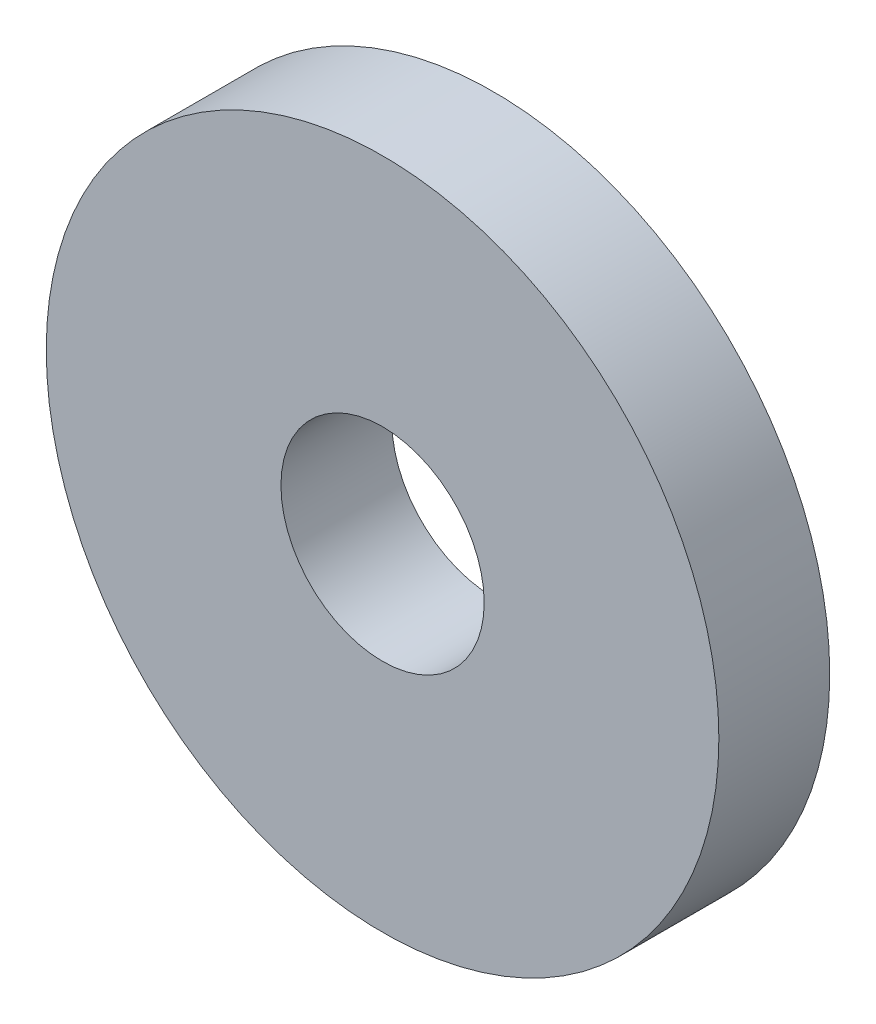
ISO-10303-21;
HEADER;
FILE_DESCRIPTION(('STEP AP214'),'2;1');
FILE_NAME('part.step','',(''),(''),'','','');
FILE_SCHEMA(('AUTOMOTIVE_DESIGN { 1 0 10303 214 1 1 1 1 }'));
ENDSEC;
DATA;
#1=APPLICATION_CONTEXT('core data for automotive mechanical design processes');
#2=APPLICATION_PROTOCOL_DEFINITION('international standard','automotive_design',2000,#1);
#3=PRODUCT_CONTEXT('',#1,'mechanical');
#4=PRODUCT('Part','Part','',(#3));
#5=PRODUCT_RELATED_PRODUCT_CATEGORY('part','',(#4));
#6=PRODUCT_DEFINITION_FORMATION('','',#4);
#7=PRODUCT_DEFINITION_CONTEXT('part definition',#1,'design');
#8=PRODUCT_DEFINITION('design','',#6,#7);
#9=PRODUCT_DEFINITION_SHAPE('','',#8);
#10=(LENGTH_UNIT() NAMED_UNIT(*) SI_UNIT(.MILLI.,.METRE.));
#11=(NAMED_UNIT(*) PLANE_ANGLE_UNIT() SI_UNIT($,.RADIAN.));
#12=(NAMED_UNIT(*) SI_UNIT($,.STERADIAN.) SOLID_ANGLE_UNIT());
#13=UNCERTAINTY_MEASURE_WITH_UNIT(LENGTH_MEASURE(1.E-05),#10,'distance_accuracy_value','');
#14=(GEOMETRIC_REPRESENTATION_CONTEXT(3) GLOBAL_UNCERTAINTY_ASSIGNED_CONTEXT((#13)) GLOBAL_UNIT_ASSIGNED_CONTEXT((#10,
#11,#12)) REPRESENTATION_CONTEXT('',''));
#15=CARTESIAN_POINT('',(0.,0.,0.));
#16=DIRECTION('',(0.,0.,1.));
#17=DIRECTION('',(1.,0.,0.));
#18=AXIS2_PLACEMENT_3D('',#15,#16,#17);
#19=CARTESIAN_POINT('',(0.,0.,0.));
#20=DIRECTION('',(0.,0.,1.));
#21=DIRECTION('',(1.,0.,0.));
#22=AXIS2_PLACEMENT_3D('',#19,#20,#21);
#23=PLANE('',#22);
#24=CARTESIAN_POINT('',(0.,0.,0.));
#25=DIRECTION('',(0.,0.,1.));
#26=DIRECTION('',(1.,0.,0.));
#27=AXIS2_PLACEMENT_3D('',#24,#25,#26);
#28=CIRCLE('',#27,2.75);
#29=CARTESIAN_POINT('',(2.75,0.,0.));
#30=VERTEX_POINT('',#29);
#31=EDGE_CURVE('E30',#30,#30,#28,.T.);
#32=ORIENTED_EDGE('',*,*,#31,.T.);
#33=EDGE_LOOP('',(#32));
#34=FACE_BOUND('',#33,.T.);
#35=CARTESIAN_POINT('',(0.,0.,0.));
#36=DIRECTION('',(0.,0.,1.));
#37=DIRECTION('',(1.,0.,0.));
#38=AXIS2_PLACEMENT_3D('',#35,#36,#37);
#39=CIRCLE('',#38,9.09961094371469);
#40=CARTESIAN_POINT('',(9.09961094371469,0.,0.));
#41=VERTEX_POINT('',#40);
#42=EDGE_CURVE('E17',#41,#41,#39,.T.);
#43=ORIENTED_EDGE('',*,*,#42,.F.);
#44=EDGE_LOOP('',(#43));
#45=FACE_BOUND('',#44,.T.);
#46=ADVANCED_FACE('F14',(#34,#45),#23,.F.);
#47=CARTESIAN_POINT('',(0.,0.,-25.7375864178399));
#48=DIRECTION('',(0.,0.,1.));
#49=DIRECTION('',(1.,0.,0.));
#50=AXIS2_PLACEMENT_3D('',#47,#48,#49);
#51=CYLINDRICAL_SURFACE('',#50,9.09961094371469);
#52=ORIENTED_EDGE('',*,*,#42,.T.);
#53=EDGE_LOOP('',(#52));
#54=FACE_BOUND('',#53,.T.);
#55=CARTESIAN_POINT('',(0.,0.,3.));
#56=DIRECTION('',(0.,0.,1.));
#57=DIRECTION('',(1.,0.,0.));
#58=AXIS2_PLACEMENT_3D('',#55,#56,#57);
#59=CIRCLE('',#58,9.09961094371469);
#60=CARTESIAN_POINT('',(9.09961094371469,0.,3.));
#61=VERTEX_POINT('',#60);
#62=EDGE_CURVE('E22',#61,#61,#59,.T.);
#63=ORIENTED_EDGE('',*,*,#62,.F.);
#64=EDGE_LOOP('',(#63));
#65=FACE_BOUND('',#64,.T.);
#66=ADVANCED_FACE('F39',(#54,#65),#51,.T.);
#67=CARTESIAN_POINT('',(0.,0.,0.));
#68=DIRECTION('',(0.,0.,1.));
#69=DIRECTION('',(1.,0.,0.));
#70=AXIS2_PLACEMENT_3D('',#67,#68,#69);
#71=CYLINDRICAL_SURFACE('',#70,2.75);
#72=ORIENTED_EDGE('',*,*,#31,.F.);
#73=EDGE_LOOP('',(#72));
#74=FACE_BOUND('',#73,.T.);
#75=CARTESIAN_POINT('',(0.,0.,3.));
#76=DIRECTION('',(0.,0.,1.));
#77=DIRECTION('',(1.,0.,0.));
#78=AXIS2_PLACEMENT_3D('',#75,#76,#77);
#79=CIRCLE('',#78,2.75);
#80=CARTESIAN_POINT('',(2.75,0.,3.));
#81=VERTEX_POINT('',#80);
#82=EDGE_CURVE('E10',#81,#81,#79,.F.);
#83=ORIENTED_EDGE('',*,*,#82,.F.);
#84=EDGE_LOOP('',(#83));
#85=FACE_BOUND('',#84,.T.);
#86=ADVANCED_FACE('F47',(#74,#85),#71,.F.);
#87=CARTESIAN_POINT('',(0.,0.,3.));
#88=DIRECTION('',(0.,0.,1.));
#89=DIRECTION('',(1.,0.,0.));
#90=AXIS2_PLACEMENT_3D('',#87,#88,#89);
#91=PLANE('',#90);
#92=ORIENTED_EDGE('',*,*,#82,.T.);
#93=EDGE_LOOP('',(#92));
#94=FACE_BOUND('',#93,.T.);
#95=ORIENTED_EDGE('',*,*,#62,.T.);
#96=EDGE_LOOP('',(#95));
#97=FACE_BOUND('',#96,.T.);
#98=ADVANCED_FACE('F48',(#94,#97),#91,.T.);
#99=CLOSED_SHELL('',(#46,#66,#86,#98));
#100=MANIFOLD_SOLID_BREP('B1',#99);
#101=ADVANCED_BREP_SHAPE_REPRESENTATION('',(#18,#100),#14);
#102=SHAPE_DEFINITION_REPRESENTATION(#9,#101);
ENDSEC;
END-ISO-10303-21;
